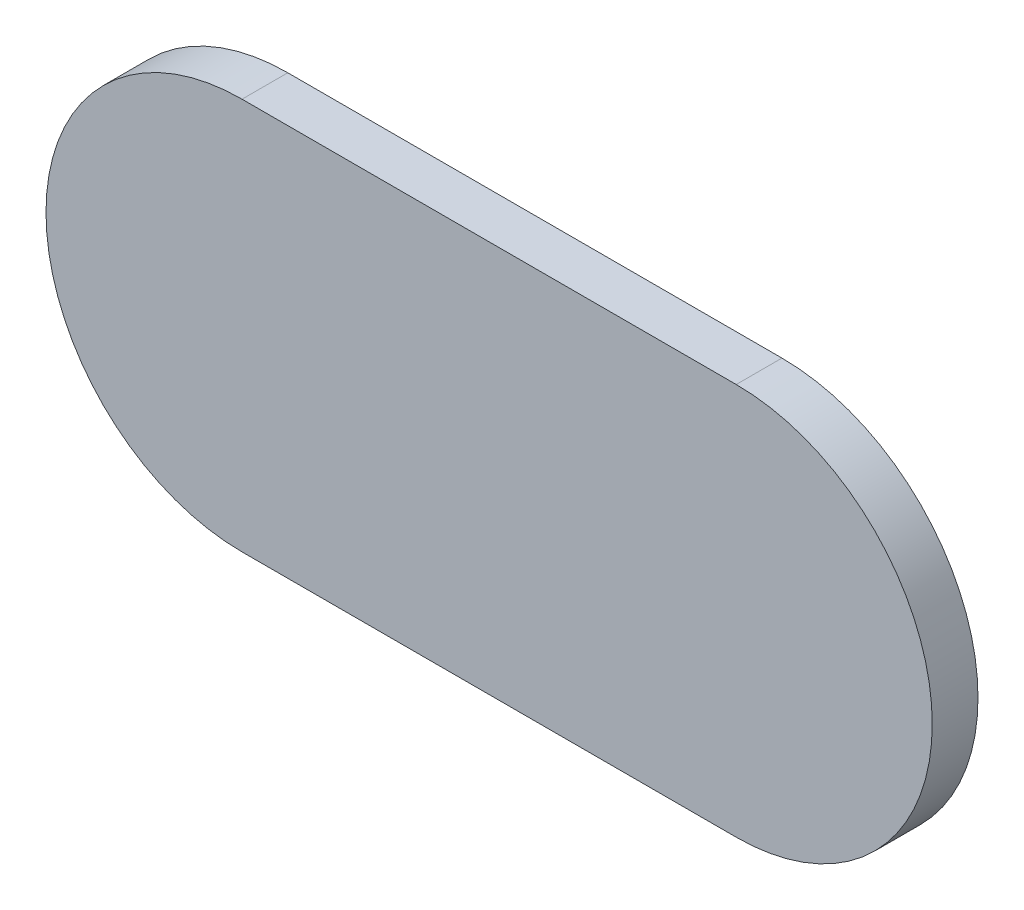
ISO-10303-21;
HEADER;
FILE_DESCRIPTION(('STEP AP214'),'2;1');
FILE_NAME('part.step','',(''),(''),'','','');
FILE_SCHEMA(('AUTOMOTIVE_DESIGN { 1 0 10303 214 1 1 1 1 }'));
ENDSEC;
DATA;
#1=APPLICATION_CONTEXT('core data for automotive mechanical design processes');
#2=APPLICATION_PROTOCOL_DEFINITION('international standard','automotive_design',2000,#1);
#3=PRODUCT_CONTEXT('',#1,'mechanical');
#4=PRODUCT('Part','Part','',(#3));
#5=PRODUCT_RELATED_PRODUCT_CATEGORY('part','',(#4));
#6=PRODUCT_DEFINITION_FORMATION('','',#4);
#7=PRODUCT_DEFINITION_CONTEXT('part definition',#1,'design');
#8=PRODUCT_DEFINITION('design','',#6,#7);
#9=PRODUCT_DEFINITION_SHAPE('','',#8);
#10=(LENGTH_UNIT() NAMED_UNIT(*) SI_UNIT(.MILLI.,.METRE.));
#11=(NAMED_UNIT(*) PLANE_ANGLE_UNIT() SI_UNIT($,.RADIAN.));
#12=(NAMED_UNIT(*) SI_UNIT($,.STERADIAN.) SOLID_ANGLE_UNIT());
#13=UNCERTAINTY_MEASURE_WITH_UNIT(LENGTH_MEASURE(1.E-05),#10,'distance_accuracy_value','');
#14=(GEOMETRIC_REPRESENTATION_CONTEXT(3) GLOBAL_UNCERTAINTY_ASSIGNED_CONTEXT((#13)) GLOBAL_UNIT_ASSIGNED_CONTEXT((#10,
#11,#12)) REPRESENTATION_CONTEXT('',''));
#15=CARTESIAN_POINT('',(0.,0.,0.));
#16=DIRECTION('',(0.,0.,1.));
#17=DIRECTION('',(1.,0.,0.));
#18=AXIS2_PLACEMENT_3D('',#15,#16,#17);
#19=CARTESIAN_POINT('',(149.158112,-112.83,1.635));
#20=DIRECTION('',(0.,0.,1.));
#21=DIRECTION('',(1.,0.,0.));
#22=AXIS2_PLACEMENT_3D('',#19,#20,#21);
#23=PLANE('',#22);
#24=DIRECTION('',(-1.,0.,0.));
#25=VECTOR('',#24,1.);
#26=CARTESIAN_POINT('',(149.158112,-112.83,1.635));
#27=LINE('',#26,#25);
#28=CARTESIAN_POINT('',(149.158112,-112.83,1.635));
#29=VERTEX_POINT('',#28);
#30=CARTESIAN_POINT('',(148.78,-112.83,1.635));
#31=VERTEX_POINT('',#30);
#32=EDGE_CURVE('E81',#29,#31,#27,.T.);
#33=ORIENTED_EDGE('',*,*,#32,.T.);
#34=CARTESIAN_POINT('',(148.78,-112.98,1.635));
#35=DIRECTION('',(0.,0.,1.));
#36=DIRECTION('',(1.894780628694E-13,1.,0.));
#37=AXIS2_PLACEMENT_3D('',#34,#35,#36);
#38=CIRCLE('',#37,0.15);
#39=CARTESIAN_POINT('',(148.78,-113.13,1.635));
#40=VERTEX_POINT('',#39);
#41=EDGE_CURVE('E99',#31,#40,#38,.T.);
#42=ORIENTED_EDGE('',*,*,#41,.T.);
#43=DIRECTION('',(1.,0.,0.));
#44=VECTOR('',#43,1.);
#45=CARTESIAN_POINT('',(148.78,-113.13,1.635));
#46=LINE('',#45,#44);
#47=CARTESIAN_POINT('',(149.158112,-113.13,1.635));
#48=VERTEX_POINT('',#47);
#49=EDGE_CURVE('E74',#40,#48,#46,.T.);
#50=ORIENTED_EDGE('',*,*,#49,.T.);
#51=CARTESIAN_POINT('',(149.158112,-112.98,1.635));
#52=DIRECTION('',(0.,0.,1.));
#53=DIRECTION('',(-1.894780628694E-13,-1.,0.));
#54=AXIS2_PLACEMENT_3D('',#51,#52,#53);
#55=CIRCLE('',#54,0.15);
#56=EDGE_CURVE('E11',#48,#29,#55,.T.);
#57=ORIENTED_EDGE('',*,*,#56,.T.);
#58=EDGE_LOOP('',(#33,#42,#50,#57));
#59=FACE_BOUND('',#58,.T.);
#60=ADVANCED_FACE('F17',(#59),#23,.T.);
#61=CARTESIAN_POINT('',(149.158112,-112.83,1.6));
#62=DIRECTION('',(0.,0.,1.));
#63=DIRECTION('',(1.,0.,0.));
#64=AXIS2_PLACEMENT_3D('',#61,#62,#63);
#65=PLANE('',#64);
#66=CARTESIAN_POINT('',(149.158112,-112.98,1.6));
#67=DIRECTION('',(0.,0.,1.));
#68=DIRECTION('',(-1.894780628694E-13,-1.,0.));
#69=AXIS2_PLACEMENT_3D('',#66,#67,#68);
#70=CIRCLE('',#69,0.15);
#71=CARTESIAN_POINT('',(149.158112,-113.13,1.6));
#72=VERTEX_POINT('',#71);
#73=CARTESIAN_POINT('',(149.158112,-112.83,1.6));
#74=VERTEX_POINT('',#73);
#75=EDGE_CURVE('E25',#72,#74,#70,.T.);
#76=ORIENTED_EDGE('',*,*,#75,.F.);
#77=DIRECTION('',(1.,0.,0.));
#78=VECTOR('',#77,1.);
#79=CARTESIAN_POINT('',(148.78,-113.13,1.6));
#80=LINE('',#79,#78);
#81=CARTESIAN_POINT('',(148.78,-113.13,1.6));
#82=VERTEX_POINT('',#81);
#83=EDGE_CURVE('E103',#82,#72,#80,.T.);
#84=ORIENTED_EDGE('',*,*,#83,.F.);
#85=CARTESIAN_POINT('',(148.78,-112.98,1.6));
#86=DIRECTION('',(0.,0.,1.));
#87=DIRECTION('',(1.894780628694E-13,1.,0.));
#88=AXIS2_PLACEMENT_3D('',#85,#86,#87);
#89=CIRCLE('',#88,0.15);
#90=CARTESIAN_POINT('',(148.78,-112.83,1.6));
#91=VERTEX_POINT('',#90);
#92=EDGE_CURVE('E83',#91,#82,#89,.T.);
#93=ORIENTED_EDGE('',*,*,#92,.F.);
#94=DIRECTION('',(-1.,0.,0.));
#95=VECTOR('',#94,1.);
#96=CARTESIAN_POINT('',(149.158112,-112.83,1.6));
#97=LINE('',#96,#95);
#98=EDGE_CURVE('E79',#74,#91,#97,.T.);
#99=ORIENTED_EDGE('',*,*,#98,.F.);
#100=EDGE_LOOP('',(#76,#84,#93,#99));
#101=FACE_BOUND('',#100,.T.);
#102=ADVANCED_FACE('F85',(#101),#65,.F.);
#103=CARTESIAN_POINT('',(149.158112,-112.98,1.6));
#104=DIRECTION('',(0.,0.,-1.));
#105=DIRECTION('',(-1.894780628694E-13,-1.,0.));
#106=AXIS2_PLACEMENT_3D('',#103,#104,#105);
#107=CYLINDRICAL_SURFACE('',#106,0.15);
#108=ORIENTED_EDGE('',*,*,#75,.T.);
#109=DIRECTION('',(0.,0.,1.));
#110=VECTOR('',#109,1.);
#111=CARTESIAN_POINT('',(149.158112,-112.83,1.6));
#112=LINE('',#111,#110);
#113=EDGE_CURVE('E68',#74,#29,#112,.T.);
#114=ORIENTED_EDGE('',*,*,#113,.T.);
#115=ORIENTED_EDGE('',*,*,#56,.F.);
#116=DIRECTION('',(0.,0.,1.));
#117=VECTOR('',#116,1.);
#118=CARTESIAN_POINT('',(149.158112,-113.13,1.6));
#119=LINE('',#118,#117);
#120=EDGE_CURVE('E71',#72,#48,#119,.T.);
#121=ORIENTED_EDGE('',*,*,#120,.F.);
#122=EDGE_LOOP('',(#108,#114,#115,#121));
#123=FACE_BOUND('',#122,.T.);
#124=ADVANCED_FACE('F67',(#123),#107,.T.);
#125=CARTESIAN_POINT('',(148.78,-113.13,1.6));
#126=DIRECTION('',(0.,1.,0.));
#127=DIRECTION('',(1.,0.,0.));
#128=AXIS2_PLACEMENT_3D('',#125,#126,#127);
#129=PLANE('',#128);
#130=ORIENTED_EDGE('',*,*,#83,.T.);
#131=ORIENTED_EDGE('',*,*,#120,.T.);
#132=ORIENTED_EDGE('',*,*,#49,.F.);
#133=DIRECTION('',(0.,0.,1.));
#134=VECTOR('',#133,1.);
#135=CARTESIAN_POINT('',(148.78,-113.13,1.6));
#136=LINE('',#135,#134);
#137=EDGE_CURVE('E104',#82,#40,#136,.T.);
#138=ORIENTED_EDGE('',*,*,#137,.F.);
#139=EDGE_LOOP('',(#130,#131,#132,#138));
#140=FACE_BOUND('',#139,.T.);
#141=ADVANCED_FACE('F120',(#140),#129,.F.);
#142=CARTESIAN_POINT('',(148.78,-112.98,1.6));
#143=DIRECTION('',(0.,0.,-1.));
#144=DIRECTION('',(1.894780628694E-13,1.,0.));
#145=AXIS2_PLACEMENT_3D('',#142,#143,#144);
#146=CYLINDRICAL_SURFACE('',#145,0.15);
#147=ORIENTED_EDGE('',*,*,#92,.T.);
#148=ORIENTED_EDGE('',*,*,#137,.T.);
#149=ORIENTED_EDGE('',*,*,#41,.F.);
#150=DIRECTION('',(0.,0.,1.));
#151=VECTOR('',#150,1.);
#152=CARTESIAN_POINT('',(148.78,-112.83,1.6));
#153=LINE('',#152,#151);
#154=EDGE_CURVE('E89',#91,#31,#153,.T.);
#155=ORIENTED_EDGE('',*,*,#154,.F.);
#156=EDGE_LOOP('',(#147,#148,#149,#155));
#157=FACE_BOUND('',#156,.T.);
#158=ADVANCED_FACE('F122',(#157),#146,.T.);
#159=CARTESIAN_POINT('',(149.158112,-112.83,1.6));
#160=DIRECTION('',(0.,-1.,0.));
#161=DIRECTION('',(0.,0.,-1.));
#162=AXIS2_PLACEMENT_3D('',#159,#160,#161);
#163=PLANE('',#162);
#164=ORIENTED_EDGE('',*,*,#98,.T.);
#165=ORIENTED_EDGE('',*,*,#154,.T.);
#166=ORIENTED_EDGE('',*,*,#32,.F.);
#167=ORIENTED_EDGE('',*,*,#113,.F.);
#168=EDGE_LOOP('',(#164,#165,#166,#167));
#169=FACE_BOUND('',#168,.T.);
#170=ADVANCED_FACE('F77',(#169),#163,.F.);
#171=CLOSED_SHELL('',(#60,#102,#124,#141,#158,#170));
#172=MANIFOLD_SOLID_BREP('B1',#171);
#173=ADVANCED_BREP_SHAPE_REPRESENTATION('',(#18,#172),#14);
#174=SHAPE_DEFINITION_REPRESENTATION(#9,#173);
ENDSEC;
END-ISO-10303-21;
